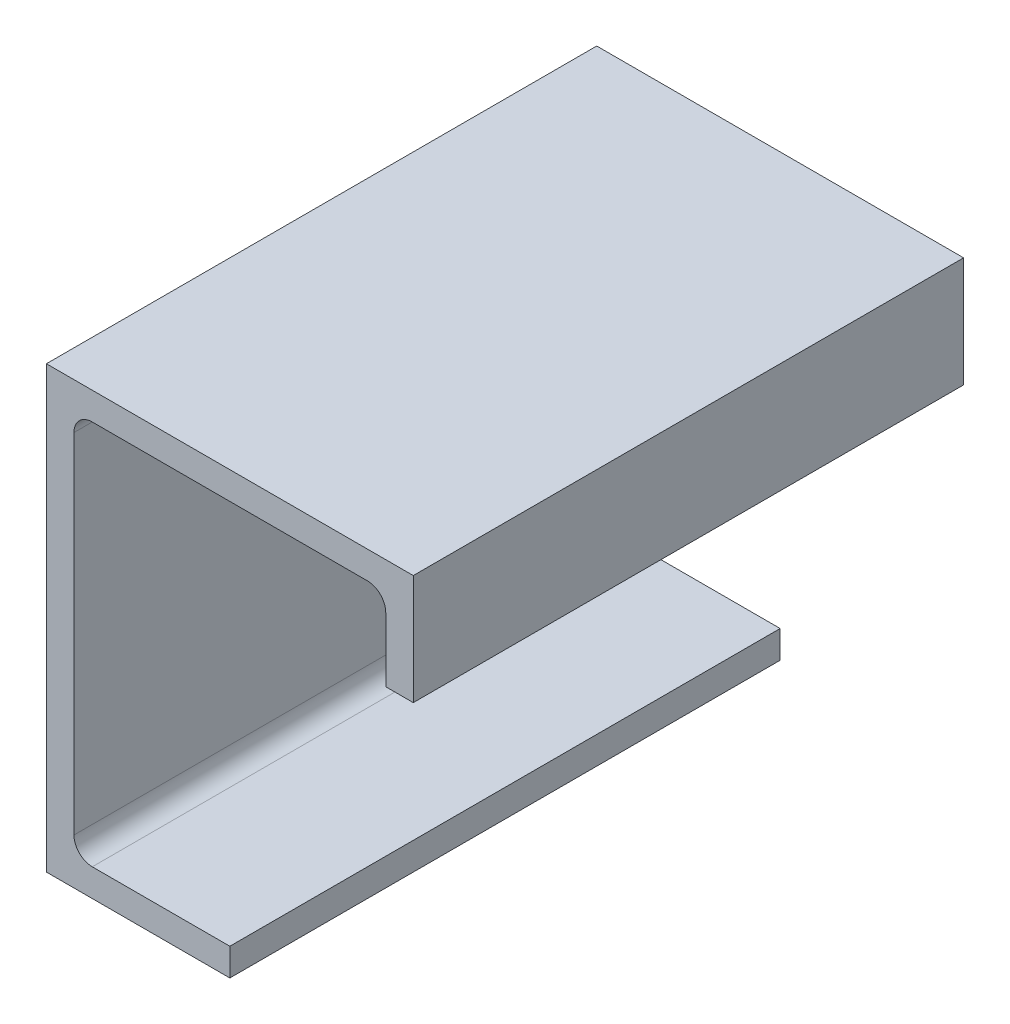
ISO-10303-21;
HEADER;
FILE_DESCRIPTION(('STEP AP214'),'2;1');
FILE_NAME('part.step','',(''),(''),'','','');
FILE_SCHEMA(('AUTOMOTIVE_DESIGN { 1 0 10303 214 1 1 1 1 }'));
ENDSEC;
DATA;
#1=APPLICATION_CONTEXT('core data for automotive mechanical design processes');
#2=APPLICATION_PROTOCOL_DEFINITION('international standard','automotive_design',2000,#1);
#3=PRODUCT_CONTEXT('',#1,'mechanical');
#4=PRODUCT('Part','Part','',(#3));
#5=PRODUCT_RELATED_PRODUCT_CATEGORY('part','',(#4));
#6=PRODUCT_DEFINITION_FORMATION('','',#4);
#7=PRODUCT_DEFINITION_CONTEXT('part definition',#1,'design');
#8=PRODUCT_DEFINITION('design','',#6,#7);
#9=PRODUCT_DEFINITION_SHAPE('','',#8);
#10=(LENGTH_UNIT() NAMED_UNIT(*) SI_UNIT(.MILLI.,.METRE.));
#11=(NAMED_UNIT(*) PLANE_ANGLE_UNIT() SI_UNIT($,.RADIAN.));
#12=(NAMED_UNIT(*) SI_UNIT($,.STERADIAN.) SOLID_ANGLE_UNIT());
#13=UNCERTAINTY_MEASURE_WITH_UNIT(LENGTH_MEASURE(1.E-05),#10,'distance_accuracy_value','');
#14=(GEOMETRIC_REPRESENTATION_CONTEXT(3) GLOBAL_UNCERTAINTY_ASSIGNED_CONTEXT((#13)) GLOBAL_UNIT_ASSIGNED_CONTEXT((#10,
#11,#12)) REPRESENTATION_CONTEXT('',''));
#15=CARTESIAN_POINT('',(0.,0.,0.));
#16=DIRECTION('',(0.,0.,1.));
#17=DIRECTION('',(1.,0.,0.));
#18=AXIS2_PLACEMENT_3D('',#15,#16,#17);
#19=CARTESIAN_POINT('',(0.,0.,47.625));
#20=DIRECTION('',(0.,1.,0.));
#21=DIRECTION('',(0.,0.,1.));
#22=AXIS2_PLACEMENT_3D('',#19,#20,#21);
#23=PLANE('',#22);
#24=DIRECTION('',(1.,0.,0.));
#25=VECTOR('',#24,1.);
#26=CARTESIAN_POINT('',(0.,0.,-47.625));
#27=LINE('',#26,#25);
#28=CARTESIAN_POINT('',(0.,0.,-47.625));
#29=VERTEX_POINT('',#28);
#30=CARTESIAN_POINT('',(31.75,0.,-47.625));
#31=VERTEX_POINT('',#30);
#32=EDGE_CURVE('E152',#29,#31,#27,.T.);
#33=ORIENTED_EDGE('',*,*,#32,.T.);
#34=DIRECTION('',(0.,0.,-1.));
#35=VECTOR('',#34,1.);
#36=CARTESIAN_POINT('',(31.75,0.,47.625));
#37=LINE('',#36,#35);
#38=CARTESIAN_POINT('',(31.75,0.,47.625));
#39=VERTEX_POINT('',#38);
#40=EDGE_CURVE('E132',#39,#31,#37,.T.);
#41=ORIENTED_EDGE('',*,*,#40,.F.);
#42=DIRECTION('',(1.,0.,0.));
#43=VECTOR('',#42,1.);
#44=CARTESIAN_POINT('',(0.,0.,47.625));
#45=LINE('',#44,#43);
#46=CARTESIAN_POINT('',(0.,0.,47.625));
#47=VERTEX_POINT('',#46);
#48=EDGE_CURVE('E140',#47,#39,#45,.T.);
#49=ORIENTED_EDGE('',*,*,#48,.F.);
#50=DIRECTION('',(0.,0.,-1.));
#51=VECTOR('',#50,1.);
#52=CARTESIAN_POINT('',(0.,0.,47.625));
#53=LINE('',#52,#51);
#54=EDGE_CURVE('E207',#47,#29,#53,.T.);
#55=ORIENTED_EDGE('',*,*,#54,.T.);
#56=EDGE_LOOP('',(#33,#41,#49,#55));
#57=FACE_BOUND('',#56,.T.);
#58=ADVANCED_FACE('F33',(#57),#23,.F.);
#59=CARTESIAN_POINT('',(31.75,0.,47.625));
#60=DIRECTION('',(-1.,0.,0.));
#61=DIRECTION('',(0.,0.,1.));
#62=AXIS2_PLACEMENT_3D('',#59,#60,#61);
#63=PLANE('',#62);
#64=DIRECTION('',(0.,1.,0.));
#65=VECTOR('',#64,1.);
#66=CARTESIAN_POINT('',(31.75,0.,-47.625));
#67=LINE('',#66,#65);
#68=CARTESIAN_POINT('',(31.75,4.7625,-47.625));
#69=VERTEX_POINT('',#68);
#70=EDGE_CURVE('E234',#31,#69,#67,.T.);
#71=ORIENTED_EDGE('',*,*,#70,.T.);
#72=DIRECTION('',(0.,0.,-1.));
#73=VECTOR('',#72,1.);
#74=CARTESIAN_POINT('',(31.75,4.7625,47.625));
#75=LINE('',#74,#73);
#76=CARTESIAN_POINT('',(31.75,4.7625,47.625));
#77=VERTEX_POINT('',#76);
#78=EDGE_CURVE('E135',#77,#69,#75,.T.);
#79=ORIENTED_EDGE('',*,*,#78,.F.);
#80=DIRECTION('',(0.,1.,0.));
#81=VECTOR('',#80,1.);
#82=CARTESIAN_POINT('',(31.75,0.,47.625));
#83=LINE('',#82,#81);
#84=EDGE_CURVE('E128',#39,#77,#83,.T.);
#85=ORIENTED_EDGE('',*,*,#84,.F.);
#86=ORIENTED_EDGE('',*,*,#40,.T.);
#87=EDGE_LOOP('',(#71,#79,#85,#86));
#88=FACE_BOUND('',#87,.T.);
#89=ADVANCED_FACE('F130',(#88),#63,.F.);
#90=CARTESIAN_POINT('',(31.75,4.7625,47.625));
#91=DIRECTION('',(0.,-1.,0.));
#92=DIRECTION('',(1.,0.,0.));
#93=AXIS2_PLACEMENT_3D('',#90,#91,#92);
#94=PLANE('',#93);
#95=DIRECTION('',(-1.,0.,0.));
#96=VECTOR('',#95,1.);
#97=CARTESIAN_POINT('',(31.75,4.7625,-47.625));
#98=LINE('',#97,#96);
#99=CARTESIAN_POINT('',(7.93750000000001,4.7625,-47.625));
#100=VERTEX_POINT('',#99);
#101=EDGE_CURVE('E236',#69,#100,#98,.T.);
#102=ORIENTED_EDGE('',*,*,#101,.T.);
#103=DIRECTION('',(0.,0.,-1.));
#104=VECTOR('',#103,1.);
#105=CARTESIAN_POINT('',(7.93750000000001,4.7625,47.625));
#106=LINE('',#105,#104);
#107=CARTESIAN_POINT('',(7.93750000000001,4.7625,47.625));
#108=VERTEX_POINT('',#107);
#109=EDGE_CURVE('E172',#100,#108,#106,.F.);
#110=ORIENTED_EDGE('',*,*,#109,.T.);
#111=DIRECTION('',(-1.,0.,0.));
#112=VECTOR('',#111,1.);
#113=CARTESIAN_POINT('',(31.75,4.7625,47.625));
#114=LINE('',#113,#112);
#115=EDGE_CURVE('E139',#77,#108,#114,.T.);
#116=ORIENTED_EDGE('',*,*,#115,.F.);
#117=ORIENTED_EDGE('',*,*,#78,.T.);
#118=EDGE_LOOP('',(#102,#110,#116,#117));
#119=FACE_BOUND('',#118,.T.);
#120=ADVANCED_FACE('F258',(#119),#94,.F.);
#121=CARTESIAN_POINT('',(4.7625,71.4375,47.625));
#122=DIRECTION('',(-1.,0.,0.));
#123=DIRECTION('',(0.,-1.,0.));
#124=AXIS2_PLACEMENT_3D('',#121,#122,#123);
#125=PLANE('',#124);
#126=DIRECTION('',(0.,1.,0.));
#127=VECTOR('',#126,1.);
#128=CARTESIAN_POINT('',(4.7625,71.4375,47.625));
#129=LINE('',#128,#127);
#130=CARTESIAN_POINT('',(4.76250000000001,7.9375,47.625));
#131=VERTEX_POINT('',#130);
#132=CARTESIAN_POINT('',(4.7625,68.2625,47.625));
#133=VERTEX_POINT('',#132);
#134=EDGE_CURVE('E248',#131,#133,#129,.T.);
#135=ORIENTED_EDGE('',*,*,#134,.F.);
#136=DIRECTION('',(0.,0.,-1.));
#137=VECTOR('',#136,1.);
#138=CARTESIAN_POINT('',(4.76250000000001,7.9375,-47.625));
#139=LINE('',#138,#137);
#140=CARTESIAN_POINT('',(4.76250000000001,7.9375,-47.625));
#141=VERTEX_POINT('',#140);
#142=EDGE_CURVE('E169',#131,#141,#139,.T.);
#143=ORIENTED_EDGE('',*,*,#142,.T.);
#144=DIRECTION('',(0.,1.,0.));
#145=VECTOR('',#144,1.);
#146=CARTESIAN_POINT('',(4.7625,71.4375,-47.625));
#147=LINE('',#146,#145);
#148=CARTESIAN_POINT('',(4.7625,68.2625,-47.625));
#149=VERTEX_POINT('',#148);
#150=EDGE_CURVE('E199',#141,#149,#147,.T.);
#151=ORIENTED_EDGE('',*,*,#150,.T.);
#152=DIRECTION('',(0.,0.,-1.));
#153=VECTOR('',#152,1.);
#154=CARTESIAN_POINT('',(4.7625,68.2625,47.625));
#155=LINE('',#154,#153);
#156=EDGE_CURVE('E156',#149,#133,#155,.F.);
#157=ORIENTED_EDGE('',*,*,#156,.T.);
#158=EDGE_LOOP('',(#135,#143,#151,#157));
#159=FACE_BOUND('',#158,.T.);
#160=ADVANCED_FACE('F241',(#159),#125,.F.);
#161=CARTESIAN_POINT('',(58.7375,71.4375,47.625));
#162=DIRECTION('',(0.,1.,0.));
#163=DIRECTION('',(0.,0.,1.));
#164=AXIS2_PLACEMENT_3D('',#161,#162,#163);
#165=PLANE('',#164);
#166=DIRECTION('',(1.,0.,0.));
#167=VECTOR('',#166,1.);
#168=CARTESIAN_POINT('',(58.7375,71.4375,-47.625));
#169=LINE('',#168,#167);
#170=CARTESIAN_POINT('',(7.9375,71.4375,-47.625));
#171=VERTEX_POINT('',#170);
#172=CARTESIAN_POINT('',(55.5625,71.4375,-47.625));
#173=VERTEX_POINT('',#172);
#174=EDGE_CURVE('E195',#171,#173,#169,.T.);
#175=ORIENTED_EDGE('',*,*,#174,.T.);
#176=DIRECTION('',(0.,0.,-1.));
#177=VECTOR('',#176,1.);
#178=CARTESIAN_POINT('',(55.5625,71.4375,47.625));
#179=LINE('',#178,#177);
#180=CARTESIAN_POINT('',(55.5625,71.4375,47.625));
#181=VERTEX_POINT('',#180);
#182=EDGE_CURVE('E54',#173,#181,#179,.F.);
#183=ORIENTED_EDGE('',*,*,#182,.T.);
#184=DIRECTION('',(1.,0.,0.));
#185=VECTOR('',#184,1.);
#186=CARTESIAN_POINT('',(58.7375,71.4375,47.625));
#187=LINE('',#186,#185);
#188=CARTESIAN_POINT('',(7.9375,71.4375,47.625));
#189=VERTEX_POINT('',#188);
#190=EDGE_CURVE('E227',#189,#181,#187,.T.);
#191=ORIENTED_EDGE('',*,*,#190,.F.);
#192=DIRECTION('',(0.,0.,-1.));
#193=VECTOR('',#192,1.);
#194=CARTESIAN_POINT('',(7.9375,71.4375,-47.625));
#195=LINE('',#194,#193);
#196=EDGE_CURVE('E153',#189,#171,#195,.T.);
#197=ORIENTED_EDGE('',*,*,#196,.T.);
#198=EDGE_LOOP('',(#175,#183,#191,#197));
#199=FACE_BOUND('',#198,.T.);
#200=ADVANCED_FACE('F249',(#199),#165,.F.);
#201=CARTESIAN_POINT('',(58.7375,57.15,47.625));
#202=DIRECTION('',(1.,0.,0.));
#203=DIRECTION('',(0.,0.,-1.));
#204=AXIS2_PLACEMENT_3D('',#201,#202,#203);
#205=PLANE('',#204);
#206=DIRECTION('',(0.,-1.,0.));
#207=VECTOR('',#206,1.);
#208=CARTESIAN_POINT('',(58.7375,57.15,47.625));
#209=LINE('',#208,#207);
#210=CARTESIAN_POINT('',(58.7375,68.2625,47.625));
#211=VERTEX_POINT('',#210);
#212=CARTESIAN_POINT('',(58.7375,57.15,47.625));
#213=VERTEX_POINT('',#212);
#214=EDGE_CURVE('E188',#211,#213,#209,.T.);
#215=ORIENTED_EDGE('',*,*,#214,.F.);
#216=DIRECTION('',(0.,0.,-1.));
#217=VECTOR('',#216,1.);
#218=CARTESIAN_POINT('',(58.7375,68.2625,-47.625));
#219=LINE('',#218,#217);
#220=CARTESIAN_POINT('',(58.7375,68.2625,-47.625));
#221=VERTEX_POINT('',#220);
#222=EDGE_CURVE('E178',#211,#221,#219,.T.);
#223=ORIENTED_EDGE('',*,*,#222,.T.);
#224=DIRECTION('',(0.,-1.,0.));
#225=VECTOR('',#224,1.);
#226=CARTESIAN_POINT('',(58.7375,57.15,-47.625));
#227=LINE('',#226,#225);
#228=CARTESIAN_POINT('',(58.7375,57.15,-47.625));
#229=VERTEX_POINT('',#228);
#230=EDGE_CURVE('E186',#221,#229,#227,.T.);
#231=ORIENTED_EDGE('',*,*,#230,.T.);
#232=DIRECTION('',(0.,0.,-1.));
#233=VECTOR('',#232,1.);
#234=CARTESIAN_POINT('',(58.7375,57.15,47.625));
#235=LINE('',#234,#233);
#236=EDGE_CURVE('E158',#213,#229,#235,.T.);
#237=ORIENTED_EDGE('',*,*,#236,.F.);
#238=EDGE_LOOP('',(#215,#223,#231,#237));
#239=FACE_BOUND('',#238,.T.);
#240=ADVANCED_FACE('F184',(#239),#205,.F.);
#241=CARTESIAN_POINT('',(63.5,57.15,47.625));
#242=DIRECTION('',(0.,1.,0.));
#243=DIRECTION('',(0.,0.,1.));
#244=AXIS2_PLACEMENT_3D('',#241,#242,#243);
#245=PLANE('',#244);
#246=DIRECTION('',(1.,0.,0.));
#247=VECTOR('',#246,1.);
#248=CARTESIAN_POINT('',(63.5,57.15,-47.625));
#249=LINE('',#248,#247);
#250=CARTESIAN_POINT('',(63.5,57.15,-47.625));
#251=VERTEX_POINT('',#250);
#252=EDGE_CURVE('E194',#229,#251,#249,.T.);
#253=ORIENTED_EDGE('',*,*,#252,.T.);
#254=DIRECTION('',(0.,0.,-1.));
#255=VECTOR('',#254,1.);
#256=CARTESIAN_POINT('',(63.5,57.15,47.625));
#257=LINE('',#256,#255);
#258=CARTESIAN_POINT('',(63.5,57.15,47.625));
#259=VERTEX_POINT('',#258);
#260=EDGE_CURVE('E215',#259,#251,#257,.T.);
#261=ORIENTED_EDGE('',*,*,#260,.F.);
#262=DIRECTION('',(1.,0.,0.));
#263=VECTOR('',#262,1.);
#264=CARTESIAN_POINT('',(63.5,57.15,47.625));
#265=LINE('',#264,#263);
#266=EDGE_CURVE('E221',#213,#259,#265,.T.);
#267=ORIENTED_EDGE('',*,*,#266,.F.);
#268=ORIENTED_EDGE('',*,*,#236,.T.);
#269=EDGE_LOOP('',(#253,#261,#267,#268));
#270=FACE_BOUND('',#269,.T.);
#271=ADVANCED_FACE('F219',(#270),#245,.F.);
#272=CARTESIAN_POINT('',(63.5,76.2,47.625));
#273=DIRECTION('',(-1.,0.,0.));
#274=DIRECTION('',(0.,-1.,0.));
#275=AXIS2_PLACEMENT_3D('',#272,#273,#274);
#276=PLANE('',#275);
#277=DIRECTION('',(0.,1.,0.));
#278=VECTOR('',#277,1.);
#279=CARTESIAN_POINT('',(63.5,76.2,-47.625));
#280=LINE('',#279,#278);
#281=CARTESIAN_POINT('',(63.5,76.2,-47.625));
#282=VERTEX_POINT('',#281);
#283=EDGE_CURVE('E197',#251,#282,#280,.T.);
#284=ORIENTED_EDGE('',*,*,#283,.T.);
#285=DIRECTION('',(0.,0.,-1.));
#286=VECTOR('',#285,1.);
#287=CARTESIAN_POINT('',(63.5,76.2,47.625));
#288=LINE('',#287,#286);
#289=CARTESIAN_POINT('',(63.5,76.2,47.625));
#290=VERTEX_POINT('',#289);
#291=EDGE_CURVE('E212',#290,#282,#288,.T.);
#292=ORIENTED_EDGE('',*,*,#291,.F.);
#293=DIRECTION('',(0.,1.,0.));
#294=VECTOR('',#293,1.);
#295=CARTESIAN_POINT('',(63.5,76.2,47.625));
#296=LINE('',#295,#294);
#297=EDGE_CURVE('E223',#259,#290,#296,.T.);
#298=ORIENTED_EDGE('',*,*,#297,.F.);
#299=ORIENTED_EDGE('',*,*,#260,.T.);
#300=EDGE_LOOP('',(#284,#292,#298,#299));
#301=FACE_BOUND('',#300,.T.);
#302=ADVANCED_FACE('F338',(#301),#276,.F.);
#303=CARTESIAN_POINT('',(0.,76.2,47.625));
#304=DIRECTION('',(0.,-1.,0.));
#305=DIRECTION('',(0.,0.,-1.));
#306=AXIS2_PLACEMENT_3D('',#303,#304,#305);
#307=PLANE('',#306);
#308=DIRECTION('',(-1.,0.,0.));
#309=VECTOR('',#308,1.);
#310=CARTESIAN_POINT('',(0.,76.2,-47.625));
#311=LINE('',#310,#309);
#312=CARTESIAN_POINT('',(0.,76.2,-47.625));
#313=VERTEX_POINT('',#312);
#314=EDGE_CURVE('E204',#282,#313,#311,.T.);
#315=ORIENTED_EDGE('',*,*,#314,.T.);
#316=DIRECTION('',(0.,0.,-1.));
#317=VECTOR('',#316,1.);
#318=CARTESIAN_POINT('',(0.,76.2,47.625));
#319=LINE('',#318,#317);
#320=CARTESIAN_POINT('',(0.,76.2,47.625));
#321=VERTEX_POINT('',#320);
#322=EDGE_CURVE('E209',#321,#313,#319,.T.);
#323=ORIENTED_EDGE('',*,*,#322,.F.);
#324=DIRECTION('',(-1.,0.,0.));
#325=VECTOR('',#324,1.);
#326=CARTESIAN_POINT('',(0.,76.2,47.625));
#327=LINE('',#326,#325);
#328=EDGE_CURVE('E225',#290,#321,#327,.T.);
#329=ORIENTED_EDGE('',*,*,#328,.F.);
#330=ORIENTED_EDGE('',*,*,#291,.T.);
#331=EDGE_LOOP('',(#315,#323,#329,#330));
#332=FACE_BOUND('',#331,.T.);
#333=ADVANCED_FACE('F347',(#332),#307,.F.);
#334=CARTESIAN_POINT('',(0.,0.,47.625));
#335=DIRECTION('',(1.,0.,0.));
#336=DIRECTION('',(0.,0.,-1.));
#337=AXIS2_PLACEMENT_3D('',#334,#335,#336);
#338=PLANE('',#337);
#339=DIRECTION('',(0.,-1.,0.));
#340=VECTOR('',#339,1.);
#341=CARTESIAN_POINT('',(0.,0.,-47.625));
#342=LINE('',#341,#340);
#343=EDGE_CURVE('E149',#313,#29,#342,.T.);
#344=ORIENTED_EDGE('',*,*,#343,.T.);
#345=ORIENTED_EDGE('',*,*,#54,.F.);
#346=DIRECTION('',(0.,-1.,0.));
#347=VECTOR('',#346,1.);
#348=CARTESIAN_POINT('',(0.,0.,47.625));
#349=LINE('',#348,#347);
#350=EDGE_CURVE('E145',#321,#47,#349,.T.);
#351=ORIENTED_EDGE('',*,*,#350,.F.);
#352=ORIENTED_EDGE('',*,*,#322,.T.);
#353=EDGE_LOOP('',(#344,#345,#351,#352));
#354=FACE_BOUND('',#353,.T.);
#355=ADVANCED_FACE('F295',(#354),#338,.F.);
#356=CARTESIAN_POINT('',(0.,0.,47.625));
#357=DIRECTION('',(0.,0.,1.));
#358=DIRECTION('',(1.,0.,0.));
#359=AXIS2_PLACEMENT_3D('',#356,#357,#358);
#360=PLANE('',#359);
#361=ORIENTED_EDGE('',*,*,#48,.T.);
#362=ORIENTED_EDGE('',*,*,#84,.T.);
#363=ORIENTED_EDGE('',*,*,#115,.T.);
#364=CARTESIAN_POINT('',(7.93750000000001,7.9375,47.625));
#365=DIRECTION('',(0.,0.,1.));
#366=DIRECTION('',(1.,0.,0.));
#367=AXIS2_PLACEMENT_3D('',#364,#365,#366);
#368=CIRCLE('',#367,3.175);
#369=EDGE_CURVE('E176',#108,#131,#368,.F.);
#370=ORIENTED_EDGE('',*,*,#369,.T.);
#371=ORIENTED_EDGE('',*,*,#134,.T.);
#372=CARTESIAN_POINT('',(7.9375,68.2625,47.625));
#373=DIRECTION('',(0.,0.,1.));
#374=DIRECTION('',(1.,0.,0.));
#375=AXIS2_PLACEMENT_3D('',#372,#373,#374);
#376=CIRCLE('',#375,3.175);
#377=EDGE_CURVE('E167',#133,#189,#376,.F.);
#378=ORIENTED_EDGE('',*,*,#377,.T.);
#379=ORIENTED_EDGE('',*,*,#190,.T.);
#380=CARTESIAN_POINT('',(55.5625,68.2625,47.625));
#381=DIRECTION('',(0.,0.,1.));
#382=DIRECTION('',(1.,0.,0.));
#383=AXIS2_PLACEMENT_3D('',#380,#381,#382);
#384=CIRCLE('',#383,3.175);
#385=EDGE_CURVE('E11',#181,#211,#384,.F.);
#386=ORIENTED_EDGE('',*,*,#385,.T.);
#387=ORIENTED_EDGE('',*,*,#214,.T.);
#388=ORIENTED_EDGE('',*,*,#266,.T.);
#389=ORIENTED_EDGE('',*,*,#297,.T.);
#390=ORIENTED_EDGE('',*,*,#328,.T.);
#391=ORIENTED_EDGE('',*,*,#350,.T.);
#392=EDGE_LOOP('',(#361,#362,#363,#370,#371,#378,#379,#386,#387,#388,#389,#390,#391));
#393=FACE_BOUND('',#392,.T.);
#394=ADVANCED_FACE('F143',(#393),#360,.T.);
#395=CARTESIAN_POINT('',(0.,0.,-47.625));
#396=DIRECTION('',(0.,0.,1.));
#397=DIRECTION('',(1.,0.,0.));
#398=AXIS2_PLACEMENT_3D('',#395,#396,#397);
#399=PLANE('',#398);
#400=ORIENTED_EDGE('',*,*,#32,.F.);
#401=ORIENTED_EDGE('',*,*,#343,.F.);
#402=ORIENTED_EDGE('',*,*,#314,.F.);
#403=ORIENTED_EDGE('',*,*,#283,.F.);
#404=ORIENTED_EDGE('',*,*,#252,.F.);
#405=ORIENTED_EDGE('',*,*,#230,.F.);
#406=CARTESIAN_POINT('',(55.5625,68.2625,-47.625));
#407=DIRECTION('',(0.,0.,1.));
#408=DIRECTION('',(1.,0.,0.));
#409=AXIS2_PLACEMENT_3D('',#406,#407,#408);
#410=CIRCLE('',#409,3.175);
#411=EDGE_CURVE('E41',#221,#173,#410,.T.);
#412=ORIENTED_EDGE('',*,*,#411,.T.);
#413=ORIENTED_EDGE('',*,*,#174,.F.);
#414=CARTESIAN_POINT('',(7.9375,68.2625,-47.625));
#415=DIRECTION('',(0.,0.,1.));
#416=DIRECTION('',(1.,0.,0.));
#417=AXIS2_PLACEMENT_3D('',#414,#415,#416);
#418=CIRCLE('',#417,3.175);
#419=EDGE_CURVE('E164',#171,#149,#418,.T.);
#420=ORIENTED_EDGE('',*,*,#419,.T.);
#421=ORIENTED_EDGE('',*,*,#150,.F.);
#422=CARTESIAN_POINT('',(7.93750000000001,7.9375,-47.625));
#423=DIRECTION('',(0.,0.,1.));
#424=DIRECTION('',(1.,0.,0.));
#425=AXIS2_PLACEMENT_3D('',#422,#423,#424);
#426=CIRCLE('',#425,3.175);
#427=EDGE_CURVE('E174',#141,#100,#426,.T.);
#428=ORIENTED_EDGE('',*,*,#427,.T.);
#429=ORIENTED_EDGE('',*,*,#101,.F.);
#430=ORIENTED_EDGE('',*,*,#70,.F.);
#431=EDGE_LOOP('',(#400,#401,#402,#403,#404,#405,#412,#413,#420,#421,#428,#429,#430));
#432=FACE_BOUND('',#431,.T.);
#433=ADVANCED_FACE('F192',(#432),#399,.F.);
#434=CARTESIAN_POINT('',(7.9375,68.2625,47.625));
#435=DIRECTION('',(0.,0.,1.));
#436=DIRECTION('',(1.,0.,0.));
#437=AXIS2_PLACEMENT_3D('',#434,#435,#436);
#438=CYLINDRICAL_SURFACE('',#437,3.175);
#439=ORIENTED_EDGE('',*,*,#377,.F.);
#440=ORIENTED_EDGE('',*,*,#156,.F.);
#441=ORIENTED_EDGE('',*,*,#419,.F.);
#442=ORIENTED_EDGE('',*,*,#196,.F.);
#443=EDGE_LOOP('',(#439,#440,#441,#442));
#444=FACE_BOUND('',#443,.T.);
#445=ADVANCED_FACE('F247',(#444),#438,.F.);
#446=CARTESIAN_POINT('',(7.93750000000001,7.9375,47.625));
#447=DIRECTION('',(0.,0.,1.));
#448=DIRECTION('',(1.,0.,0.));
#449=AXIS2_PLACEMENT_3D('',#446,#447,#448);
#450=CYLINDRICAL_SURFACE('',#449,3.175);
#451=ORIENTED_EDGE('',*,*,#369,.F.);
#452=ORIENTED_EDGE('',*,*,#109,.F.);
#453=ORIENTED_EDGE('',*,*,#427,.F.);
#454=ORIENTED_EDGE('',*,*,#142,.F.);
#455=EDGE_LOOP('',(#451,#452,#453,#454));
#456=FACE_BOUND('',#455,.T.);
#457=ADVANCED_FACE('F256',(#456),#450,.F.);
#458=CARTESIAN_POINT('',(55.5625,68.2625,47.625));
#459=DIRECTION('',(0.,0.,1.));
#460=DIRECTION('',(1.,0.,0.));
#461=AXIS2_PLACEMENT_3D('',#458,#459,#460);
#462=CYLINDRICAL_SURFACE('',#461,3.175);
#463=ORIENTED_EDGE('',*,*,#385,.F.);
#464=ORIENTED_EDGE('',*,*,#182,.F.);
#465=ORIENTED_EDGE('',*,*,#411,.F.);
#466=ORIENTED_EDGE('',*,*,#222,.F.);
#467=EDGE_LOOP('',(#463,#464,#465,#466));
#468=FACE_BOUND('',#467,.T.);
#469=ADVANCED_FACE('F35',(#468),#462,.F.);
#470=CLOSED_SHELL('',(#58,#89,#120,#160,#200,#240,#271,#302,#333,#355,#394,#433,#445,#457,#469));
#471=MANIFOLD_SOLID_BREP('B2',#470);
#472=ADVANCED_BREP_SHAPE_REPRESENTATION('',(#18,#471),#14);
#473=SHAPE_DEFINITION_REPRESENTATION(#9,#472);
ENDSEC;
END-ISO-10303-21;
